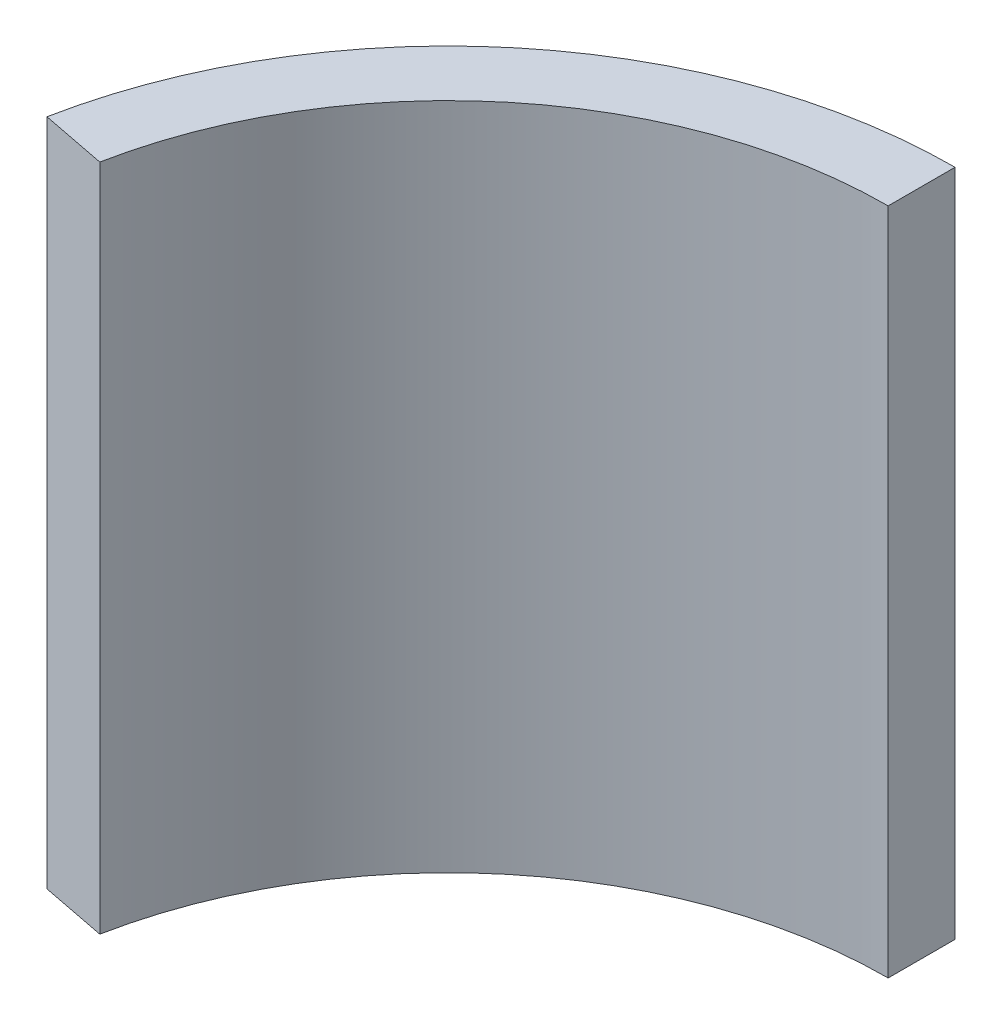
ISO-10303-21;
HEADER;
FILE_DESCRIPTION(('STEP AP214'),'2;1');
FILE_NAME('part.step','',(''),(''),'','','');
FILE_SCHEMA(('AUTOMOTIVE_DESIGN { 1 0 10303 214 1 1 1 1 }'));
ENDSEC;
DATA;
#1=APPLICATION_CONTEXT('core data for automotive mechanical design processes');
#2=APPLICATION_PROTOCOL_DEFINITION('international standard','automotive_design',2000,#1);
#3=PRODUCT_CONTEXT('',#1,'mechanical');
#4=PRODUCT('Part','Part','',(#3));
#5=PRODUCT_RELATED_PRODUCT_CATEGORY('part','',(#4));
#6=PRODUCT_DEFINITION_FORMATION('','',#4);
#7=PRODUCT_DEFINITION_CONTEXT('part definition',#1,'design');
#8=PRODUCT_DEFINITION('design','',#6,#7);
#9=PRODUCT_DEFINITION_SHAPE('','',#8);
#10=(LENGTH_UNIT() NAMED_UNIT(*) SI_UNIT(.MILLI.,.METRE.));
#11=(NAMED_UNIT(*) PLANE_ANGLE_UNIT() SI_UNIT($,.RADIAN.));
#12=(NAMED_UNIT(*) SI_UNIT($,.STERADIAN.) SOLID_ANGLE_UNIT());
#13=UNCERTAINTY_MEASURE_WITH_UNIT(LENGTH_MEASURE(1.E-05),#10,'distance_accuracy_value','');
#14=(GEOMETRIC_REPRESENTATION_CONTEXT(3) GLOBAL_UNCERTAINTY_ASSIGNED_CONTEXT((#13)) GLOBAL_UNIT_ASSIGNED_CONTEXT((#10,
#11,#12)) REPRESENTATION_CONTEXT('',''));
#15=CARTESIAN_POINT('',(0.,0.,0.));
#16=DIRECTION('',(0.,0.,1.));
#17=DIRECTION('',(1.,0.,0.));
#18=AXIS2_PLACEMENT_3D('',#15,#16,#17);
#19=CARTESIAN_POINT('',(0.,-18.,6.));
#20=DIRECTION('',(0.,-1.,0.));
#21=DIRECTION('',(0.,0.,-1.));
#22=AXIS2_PLACEMENT_3D('',#19,#20,#21);
#23=CYLINDRICAL_SURFACE('',#22,18.2);
#24=CARTESIAN_POINT('',(0.,-9.,6.));
#25=DIRECTION('',(0.,-1.,0.));
#26=DIRECTION('',(0.,0.,-1.));
#27=AXIS2_PLACEMENT_3D('',#24,#25,#26);
#28=CIRCLE('',#27,18.2);
#29=CARTESIAN_POINT('',(-17.8656147387475,-9.,2.52727628414689));
#30=VERTEX_POINT('',#29);
#31=CARTESIAN_POINT('',(0.,-9.,-12.2));
#32=VERTEX_POINT('',#31);
#33=EDGE_CURVE('E11',#30,#32,#28,.T.);
#34=ORIENTED_EDGE('',*,*,#33,.F.);
#35=DIRECTION('',(0.,1.,0.));
#36=VECTOR('',#35,1.);
#37=CARTESIAN_POINT('',(-17.8656147387475,-9.,2.52727628414689));
#38=LINE('',#37,#36);
#39=CARTESIAN_POINT('',(-17.8656147387475,15.,2.52727628414689));
#40=VERTEX_POINT('',#39);
#41=EDGE_CURVE('E87',#30,#40,#38,.T.);
#42=ORIENTED_EDGE('',*,*,#41,.T.);
#43=CARTESIAN_POINT('',(0.,15.,6.));
#44=DIRECTION('',(0.,-1.,0.));
#45=DIRECTION('',(0.,0.,-1.));
#46=AXIS2_PLACEMENT_3D('',#43,#44,#45);
#47=CIRCLE('',#46,18.2);
#48=CARTESIAN_POINT('',(0.,15.,-12.2));
#49=VERTEX_POINT('',#48);
#50=EDGE_CURVE('E84',#40,#49,#47,.T.);
#51=ORIENTED_EDGE('',*,*,#50,.T.);
#52=DIRECTION('',(0.,1.,0.));
#53=VECTOR('',#52,1.);
#54=CARTESIAN_POINT('',(0.,-9.,-12.2));
#55=LINE('',#54,#53);
#56=EDGE_CURVE('E81',#32,#49,#55,.T.);
#57=ORIENTED_EDGE('',*,*,#56,.F.);
#58=EDGE_LOOP('',(#34,#42,#51,#57));
#59=FACE_BOUND('',#58,.T.);
#60=ADVANCED_FACE('F44',(#59),#23,.T.);
#61=CARTESIAN_POINT('',(-17.8656147387475,-9.,2.52727628414689));
#62=DIRECTION('',(0.,1.,0.));
#63=DIRECTION('',(0.,0.,1.));
#64=AXIS2_PLACEMENT_3D('',#61,#62,#63);
#65=PLANE('',#64);
#66=CARTESIAN_POINT('',(0.,-9.,6.));
#67=DIRECTION('',(0.,-1.,0.));
#68=DIRECTION('',(0.,0.,-1.));
#69=AXIS2_PLACEMENT_3D('',#66,#67,#68);
#70=CIRCLE('',#69,15.8);
#71=CARTESIAN_POINT('',(-15.5097094984731,-9.,2.98521787305059));
#72=VERTEX_POINT('',#71);
#73=CARTESIAN_POINT('',(0.,-9.,-9.8));
#74=VERTEX_POINT('',#73);
#75=EDGE_CURVE('E53',#72,#74,#70,.T.);
#76=ORIENTED_EDGE('',*,*,#75,.F.);
#77=DIRECTION('',(0.981627183447664,0.,0.190808995376545));
#78=VECTOR('',#77,1.);
#79=CARTESIAN_POINT('',(-17.8656147387475,-9.,2.52727628414689));
#80=LINE('',#79,#78);
#81=EDGE_CURVE('E91',#30,#72,#80,.T.);
#82=ORIENTED_EDGE('',*,*,#81,.F.);
#83=ORIENTED_EDGE('',*,*,#33,.T.);
#84=DIRECTION('',(0.,0.,1.));
#85=VECTOR('',#84,1.);
#86=CARTESIAN_POINT('',(0.,-9.,-12.2));
#87=LINE('',#86,#85);
#88=EDGE_CURVE('E106',#32,#74,#87,.T.);
#89=ORIENTED_EDGE('',*,*,#88,.T.);
#90=EDGE_LOOP('',(#76,#82,#83,#89));
#91=FACE_BOUND('',#90,.T.);
#92=ADVANCED_FACE('F50',(#91),#65,.F.);
#93=CARTESIAN_POINT('',(0.,-18.,6.));
#94=DIRECTION('',(0.,-1.,0.));
#95=DIRECTION('',(0.,0.,-1.));
#96=AXIS2_PLACEMENT_3D('',#93,#94,#95);
#97=CYLINDRICAL_SURFACE('',#96,15.8);
#98=CARTESIAN_POINT('',(0.,15.,6.));
#99=DIRECTION('',(0.,-1.,0.));
#100=DIRECTION('',(0.,0.,-1.));
#101=AXIS2_PLACEMENT_3D('',#98,#99,#100);
#102=CIRCLE('',#101,15.8);
#103=CARTESIAN_POINT('',(-15.5097094984731,15.,2.98521787305059));
#104=VERTEX_POINT('',#103);
#105=CARTESIAN_POINT('',(0.,15.,-9.8));
#106=VERTEX_POINT('',#105);
#107=EDGE_CURVE('E95',#104,#106,#102,.T.);
#108=ORIENTED_EDGE('',*,*,#107,.F.);
#109=DIRECTION('',(0.,1.,0.));
#110=VECTOR('',#109,1.);
#111=CARTESIAN_POINT('',(-15.5097094984731,-9.,2.98521787305059));
#112=LINE('',#111,#110);
#113=EDGE_CURVE('E116',#72,#104,#112,.T.);
#114=ORIENTED_EDGE('',*,*,#113,.F.);
#115=ORIENTED_EDGE('',*,*,#75,.T.);
#116=DIRECTION('',(0.,1.,0.));
#117=VECTOR('',#116,1.);
#118=CARTESIAN_POINT('',(0.,-9.,-9.8));
#119=LINE('',#118,#117);
#120=EDGE_CURVE('E105',#74,#106,#119,.T.);
#121=ORIENTED_EDGE('',*,*,#120,.T.);
#122=EDGE_LOOP('',(#108,#114,#115,#121));
#123=FACE_BOUND('',#122,.T.);
#124=ADVANCED_FACE('F129',(#123),#97,.F.);
#125=CARTESIAN_POINT('',(-15.5097094984731,15.,2.98521787305059));
#126=DIRECTION('',(0.,-1.,0.));
#127=DIRECTION('',(0.,0.,-1.));
#128=AXIS2_PLACEMENT_3D('',#125,#126,#127);
#129=PLANE('',#128);
#130=DIRECTION('',(-0.981627183447664,0.,-0.190808995376545));
#131=VECTOR('',#130,1.);
#132=CARTESIAN_POINT('',(-15.5097094984731,15.,2.98521787305059));
#133=LINE('',#132,#131);
#134=EDGE_CURVE('E117',#104,#40,#133,.T.);
#135=ORIENTED_EDGE('',*,*,#134,.F.);
#136=ORIENTED_EDGE('',*,*,#107,.T.);
#137=DIRECTION('',(0.,0.,-1.));
#138=VECTOR('',#137,1.);
#139=CARTESIAN_POINT('',(0.,15.,-9.8));
#140=LINE('',#139,#138);
#141=EDGE_CURVE('E96',#106,#49,#140,.T.);
#142=ORIENTED_EDGE('',*,*,#141,.T.);
#143=ORIENTED_EDGE('',*,*,#50,.F.);
#144=EDGE_LOOP('',(#135,#136,#142,#143));
#145=FACE_BOUND('',#144,.T.);
#146=ADVANCED_FACE('F100',(#145),#129,.F.);
#147=CARTESIAN_POINT('',(-5.88976310068598,0.,4.85514602774073));
#148=DIRECTION('',(-0.190808995376545,0.,0.981627183447664));
#149=DIRECTION('',(0.981627183447664,0.,0.190808995376545));
#150=AXIS2_PLACEMENT_3D('',#147,#148,#149);
#151=PLANE('',#150);
#152=ORIENTED_EDGE('',*,*,#41,.F.);
#153=ORIENTED_EDGE('',*,*,#81,.T.);
#154=ORIENTED_EDGE('',*,*,#113,.T.);
#155=ORIENTED_EDGE('',*,*,#134,.T.);
#156=EDGE_LOOP('',(#152,#153,#154,#155));
#157=FACE_BOUND('',#156,.T.);
#158=ADVANCED_FACE('F132',(#157),#151,.T.);
#159=CARTESIAN_POINT('',(0.,0.,0.));
#160=DIRECTION('',(-1.,0.,0.));
#161=DIRECTION('',(0.,0.,1.));
#162=AXIS2_PLACEMENT_3D('',#159,#160,#161);
#163=PLANE('',#162);
#164=ORIENTED_EDGE('',*,*,#56,.T.);
#165=ORIENTED_EDGE('',*,*,#141,.F.);
#166=ORIENTED_EDGE('',*,*,#120,.F.);
#167=ORIENTED_EDGE('',*,*,#88,.F.);
#168=EDGE_LOOP('',(#164,#165,#166,#167));
#169=FACE_BOUND('',#168,.T.);
#170=ADVANCED_FACE('F104',(#169),#163,.F.);
#171=CLOSED_SHELL('',(#60,#92,#124,#146,#158,#170));
#172=MANIFOLD_SOLID_BREP('B2',#171);
#173=ADVANCED_BREP_SHAPE_REPRESENTATION('',(#18,#172),#14);
#174=SHAPE_DEFINITION_REPRESENTATION(#9,#173);
ENDSEC;
END-ISO-10303-21;
